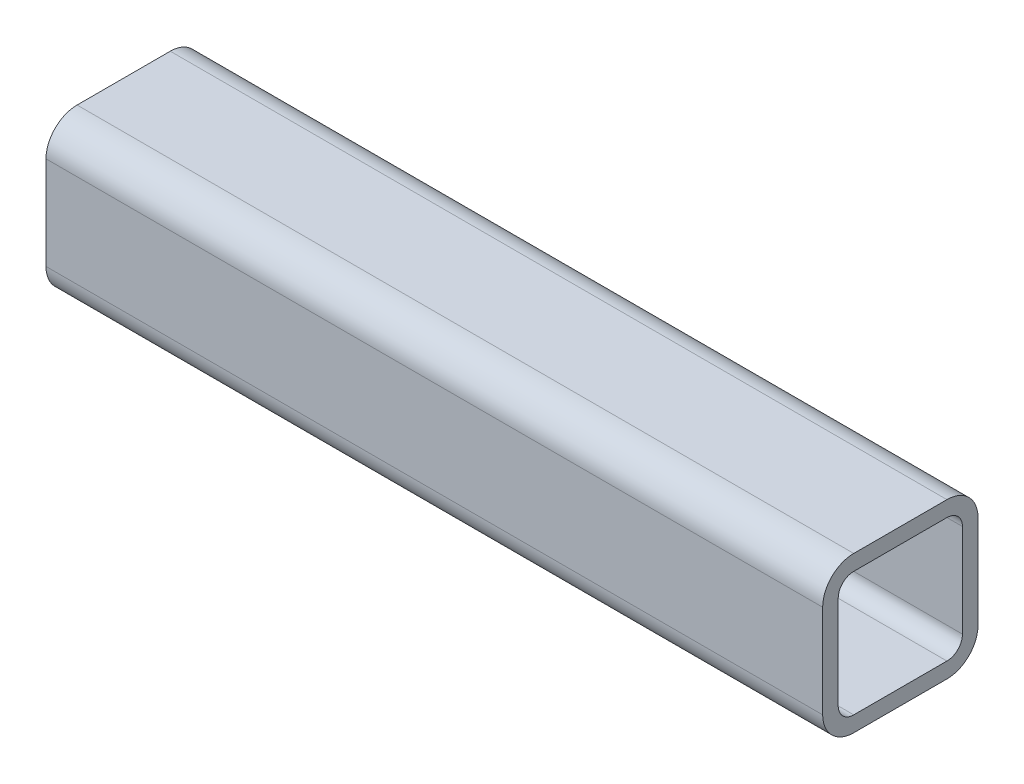
ISO-10303-21;
HEADER;
FILE_DESCRIPTION(('STEP AP214'),'2;1');
FILE_NAME('part.step','',(''),(''),'','','');
FILE_SCHEMA(('AUTOMOTIVE_DESIGN { 1 0 10303 214 1 1 1 1 }'));
ENDSEC;
DATA;
#1=APPLICATION_CONTEXT('core data for automotive mechanical design processes');
#2=APPLICATION_PROTOCOL_DEFINITION('international standard','automotive_design',2000,#1);
#3=PRODUCT_CONTEXT('',#1,'mechanical');
#4=PRODUCT('Part','Part','',(#3));
#5=PRODUCT_RELATED_PRODUCT_CATEGORY('part','',(#4));
#6=PRODUCT_DEFINITION_FORMATION('','',#4);
#7=PRODUCT_DEFINITION_CONTEXT('part definition',#1,'design');
#8=PRODUCT_DEFINITION('design','',#6,#7);
#9=PRODUCT_DEFINITION_SHAPE('','',#8);
#10=(LENGTH_UNIT() NAMED_UNIT(*) SI_UNIT(.MILLI.,.METRE.));
#11=(NAMED_UNIT(*) PLANE_ANGLE_UNIT() SI_UNIT($,.RADIAN.));
#12=(NAMED_UNIT(*) SI_UNIT($,.STERADIAN.) SOLID_ANGLE_UNIT());
#13=UNCERTAINTY_MEASURE_WITH_UNIT(LENGTH_MEASURE(1.E-05),#10,'distance_accuracy_value','');
#14=(GEOMETRIC_REPRESENTATION_CONTEXT(3) GLOBAL_UNCERTAINTY_ASSIGNED_CONTEXT((#13)) GLOBAL_UNIT_ASSIGNED_CONTEXT((#10,
#11,#12)) REPRESENTATION_CONTEXT('',''));
#15=CARTESIAN_POINT('',(0.,0.,0.));
#16=DIRECTION('',(0.,0.,1.));
#17=DIRECTION('',(1.,0.,0.));
#18=AXIS2_PLACEMENT_3D('',#15,#16,#17);
#19=CARTESIAN_POINT('',(50.,-79.9999999999999,-1094.));
#20=DIRECTION('',(1.,0.,0.));
#21=DIRECTION('',(0.,0.,-1.));
#22=AXIS2_PLACEMENT_3D('',#19,#20,#21);
#23=PLANE('',#22);
#24=DIRECTION('',(0.,1.,0.));
#25=VECTOR('',#24,1.);
#26=CARTESIAN_POINT('',(50.,-85.9999999999999,-1095.));
#27=LINE('',#26,#25);
#28=CARTESIAN_POINT('',(50.,-85.9999999999998,-1095.));
#29=VERTEX_POINT('',#28);
#30=CARTESIAN_POINT('',(50.,-73.9999999999998,-1095.));
#31=VERTEX_POINT('',#30);
#32=EDGE_CURVE('E11',#29,#31,#27,.T.);
#33=ORIENTED_EDGE('',*,*,#32,.T.);
#34=CARTESIAN_POINT('',(50.,-73.9999999999999,-1091.));
#35=DIRECTION('',(1.,0.,0.));
#36=DIRECTION('',(0.,0.,-1.));
#37=AXIS2_PLACEMENT_3D('',#34,#35,#36);
#38=CIRCLE('',#37,4.);
#39=CARTESIAN_POINT('',(50.,-69.9999999999999,-1091.));
#40=VERTEX_POINT('',#39);
#41=EDGE_CURVE('E249',#31,#40,#38,.T.);
#42=ORIENTED_EDGE('',*,*,#41,.T.);
#43=DIRECTION('',(0.,0.,1.));
#44=VECTOR('',#43,1.);
#45=CARTESIAN_POINT('',(50.,-69.9999999999999,-1079.));
#46=LINE('',#45,#44);
#47=CARTESIAN_POINT('',(50.,-69.9999999999999,-1079.));
#48=VERTEX_POINT('',#47);
#49=EDGE_CURVE('E246',#40,#48,#46,.T.);
#50=ORIENTED_EDGE('',*,*,#49,.T.);
#51=CARTESIAN_POINT('',(50.,-73.9999999999999,-1079.));
#52=DIRECTION('',(1.,0.,0.));
#53=DIRECTION('',(0.,0.,-1.));
#54=AXIS2_PLACEMENT_3D('',#51,#52,#53);
#55=CIRCLE('',#54,4.);
#56=CARTESIAN_POINT('',(50.,-73.9999999999999,-1075.));
#57=VERTEX_POINT('',#56);
#58=EDGE_CURVE('E243',#48,#57,#55,.T.);
#59=ORIENTED_EDGE('',*,*,#58,.T.);
#60=DIRECTION('',(0.,-1.,0.));
#61=VECTOR('',#60,1.);
#62=CARTESIAN_POINT('',(50.,-73.9999999999999,-1075.));
#63=LINE('',#62,#61);
#64=CARTESIAN_POINT('',(50.,-85.9999999999999,-1075.));
#65=VERTEX_POINT('',#64);
#66=EDGE_CURVE('E240',#57,#65,#63,.T.);
#67=ORIENTED_EDGE('',*,*,#66,.T.);
#68=CARTESIAN_POINT('',(50.,-85.9999999999999,-1079.));
#69=DIRECTION('',(1.,0.,0.));
#70=DIRECTION('',(0.,0.,-1.));
#71=AXIS2_PLACEMENT_3D('',#68,#69,#70);
#72=CIRCLE('',#71,4.);
#73=CARTESIAN_POINT('',(50.,-89.9999999999999,-1079.));
#74=VERTEX_POINT('',#73);
#75=EDGE_CURVE('E237',#65,#74,#72,.T.);
#76=ORIENTED_EDGE('',*,*,#75,.T.);
#77=DIRECTION('',(0.,0.,-1.));
#78=VECTOR('',#77,1.);
#79=CARTESIAN_POINT('',(50.,-89.9999999999999,-1091.));
#80=LINE('',#79,#78);
#81=CARTESIAN_POINT('',(50.,-89.9999999999999,-1091.));
#82=VERTEX_POINT('',#81);
#83=EDGE_CURVE('E234',#74,#82,#80,.T.);
#84=ORIENTED_EDGE('',*,*,#83,.T.);
#85=CARTESIAN_POINT('',(50.,-85.9999999999999,-1091.));
#86=DIRECTION('',(1.,0.,0.));
#87=DIRECTION('',(0.,0.,-1.));
#88=AXIS2_PLACEMENT_3D('',#85,#86,#87);
#89=CIRCLE('',#88,4.);
#90=EDGE_CURVE('E185',#82,#29,#89,.T.);
#91=ORIENTED_EDGE('',*,*,#90,.T.);
#92=EDGE_LOOP('',(#33,#42,#50,#59,#67,#76,#84,#91));
#93=FACE_BOUND('',#92,.T.);
#94=CARTESIAN_POINT('',(50.,-73.9999999999999,-1091.));
#95=DIRECTION('',(1.,0.,0.));
#96=DIRECTION('',(0.,0.,-1.));
#97=AXIS2_PLACEMENT_3D('',#94,#95,#96);
#98=CIRCLE('',#97,2.);
#99=CARTESIAN_POINT('',(50.,-73.9999999999999,-1093.));
#100=VERTEX_POINT('',#99);
#101=CARTESIAN_POINT('',(50.,-71.9999999999999,-1091.));
#102=VERTEX_POINT('',#101);
#103=EDGE_CURVE('E217',#100,#102,#98,.T.);
#104=ORIENTED_EDGE('',*,*,#103,.F.);
#105=DIRECTION('',(0.,1.,0.));
#106=VECTOR('',#105,1.);
#107=CARTESIAN_POINT('',(50.,-85.9999999999999,-1093.));
#108=LINE('',#107,#106);
#109=CARTESIAN_POINT('',(50.,-85.9999999999998,-1093.));
#110=VERTEX_POINT('',#109);
#111=EDGE_CURVE('E173',#110,#100,#108,.T.);
#112=ORIENTED_EDGE('',*,*,#111,.F.);
#113=CARTESIAN_POINT('',(50.,-85.9999999999999,-1091.));
#114=DIRECTION('',(1.,0.,0.));
#115=DIRECTION('',(0.,0.,-1.));
#116=AXIS2_PLACEMENT_3D('',#113,#114,#115);
#117=CIRCLE('',#116,2.);
#118=CARTESIAN_POINT('',(50.,-87.9999999999999,-1091.));
#119=VERTEX_POINT('',#118);
#120=EDGE_CURVE('E70',#119,#110,#117,.T.);
#121=ORIENTED_EDGE('',*,*,#120,.F.);
#122=DIRECTION('',(0.,0.,-1.));
#123=VECTOR('',#122,1.);
#124=CARTESIAN_POINT('',(50.,-87.9999999999999,-1091.));
#125=LINE('',#124,#123);
#126=CARTESIAN_POINT('',(50.,-87.9999999999999,-1079.));
#127=VERTEX_POINT('',#126);
#128=EDGE_CURVE('E82',#127,#119,#125,.T.);
#129=ORIENTED_EDGE('',*,*,#128,.F.);
#130=CARTESIAN_POINT('',(50.,-85.9999999999999,-1079.));
#131=DIRECTION('',(1.,0.,0.));
#132=DIRECTION('',(0.,0.,-1.));
#133=AXIS2_PLACEMENT_3D('',#130,#131,#132);
#134=CIRCLE('',#133,2.);
#135=CARTESIAN_POINT('',(50.,-85.9999999999999,-1077.));
#136=VERTEX_POINT('',#135);
#137=EDGE_CURVE('E222',#136,#127,#134,.T.);
#138=ORIENTED_EDGE('',*,*,#137,.F.);
#139=DIRECTION('',(0.,-1.,0.));
#140=VECTOR('',#139,1.);
#141=CARTESIAN_POINT('',(50.,-73.9999999999999,-1077.));
#142=LINE('',#141,#140);
#143=CARTESIAN_POINT('',(50.,-73.9999999999999,-1077.));
#144=VERTEX_POINT('',#143);
#145=EDGE_CURVE('E212',#144,#136,#142,.T.);
#146=ORIENTED_EDGE('',*,*,#145,.F.);
#147=CARTESIAN_POINT('',(50.,-73.9999999999999,-1079.));
#148=DIRECTION('',(1.,0.,0.));
#149=DIRECTION('',(0.,0.,-1.));
#150=AXIS2_PLACEMENT_3D('',#147,#148,#149);
#151=CIRCLE('',#150,2.);
#152=CARTESIAN_POINT('',(50.,-71.9999999999999,-1079.));
#153=VERTEX_POINT('',#152);
#154=EDGE_CURVE('E209',#153,#144,#151,.T.);
#155=ORIENTED_EDGE('',*,*,#154,.F.);
#156=DIRECTION('',(0.,0.,1.));
#157=VECTOR('',#156,1.);
#158=CARTESIAN_POINT('',(50.,-71.9999999999999,-1079.));
#159=LINE('',#158,#157);
#160=EDGE_CURVE('E204',#102,#153,#159,.T.);
#161=ORIENTED_EDGE('',*,*,#160,.F.);
#162=EDGE_LOOP('',(#104,#112,#121,#129,#138,#146,#155,#161));
#163=FACE_BOUND('',#162,.T.);
#164=ADVANCED_FACE('F41',(#93,#163),#23,.T.);
#165=CARTESIAN_POINT('',(-50.0000000000002,-73.9999999999998,-1085.));
#166=DIRECTION('',(-1.,0.,0.));
#167=DIRECTION('',(0.,0.,1.));
#168=AXIS2_PLACEMENT_3D('',#165,#166,#167);
#169=PLANE('',#168);
#170=CARTESIAN_POINT('',(-50.0000000000002,-73.9999999999999,-1091.));
#171=DIRECTION('',(-1.,0.,0.));
#172=DIRECTION('',(0.,0.,1.));
#173=AXIS2_PLACEMENT_3D('',#170,#171,#172);
#174=CIRCLE('',#173,4.);
#175=CARTESIAN_POINT('',(-50.0000000000002,-69.9999999999999,-1091.));
#176=VERTEX_POINT('',#175);
#177=CARTESIAN_POINT('',(-50.0000000000002,-73.9999999999998,-1095.));
#178=VERTEX_POINT('',#177);
#179=EDGE_CURVE('E190',#176,#178,#174,.T.);
#180=ORIENTED_EDGE('',*,*,#179,.T.);
#181=DIRECTION('',(0.,-1.,0.));
#182=VECTOR('',#181,1.);
#183=CARTESIAN_POINT('',(-50.0000000000002,-85.9999999999999,-1095.));
#184=LINE('',#183,#182);
#185=CARTESIAN_POINT('',(-50.0000000000002,-85.9999999999998,-1095.));
#186=VERTEX_POINT('',#185);
#187=EDGE_CURVE('E182',#178,#186,#184,.T.);
#188=ORIENTED_EDGE('',*,*,#187,.T.);
#189=CARTESIAN_POINT('',(-50.0000000000002,-85.9999999999999,-1091.));
#190=DIRECTION('',(-1.,0.,0.));
#191=DIRECTION('',(0.,0.,1.));
#192=AXIS2_PLACEMENT_3D('',#189,#190,#191);
#193=CIRCLE('',#192,4.);
#194=CARTESIAN_POINT('',(-50.0000000000002,-89.9999999999999,-1091.));
#195=VERTEX_POINT('',#194);
#196=EDGE_CURVE('E192',#186,#195,#193,.T.);
#197=ORIENTED_EDGE('',*,*,#196,.T.);
#198=DIRECTION('',(0.,0.,1.));
#199=VECTOR('',#198,1.);
#200=CARTESIAN_POINT('',(-50.0000000000002,-89.9999999999999,-1091.));
#201=LINE('',#200,#199);
#202=CARTESIAN_POINT('',(-50.0000000000002,-89.9999999999999,-1079.));
#203=VERTEX_POINT('',#202);
#204=EDGE_CURVE('E194',#195,#203,#201,.T.);
#205=ORIENTED_EDGE('',*,*,#204,.T.);
#206=CARTESIAN_POINT('',(-50.0000000000002,-85.9999999999999,-1079.));
#207=DIRECTION('',(-1.,0.,0.));
#208=DIRECTION('',(0.,0.,1.));
#209=AXIS2_PLACEMENT_3D('',#206,#207,#208);
#210=CIRCLE('',#209,4.);
#211=CARTESIAN_POINT('',(-50.0000000000002,-85.9999999999999,-1075.));
#212=VERTEX_POINT('',#211);
#213=EDGE_CURVE('E196',#203,#212,#210,.T.);
#214=ORIENTED_EDGE('',*,*,#213,.T.);
#215=DIRECTION('',(0.,1.,0.));
#216=VECTOR('',#215,1.);
#217=CARTESIAN_POINT('',(-50.0000000000002,-73.9999999999999,-1075.));
#218=LINE('',#217,#216);
#219=CARTESIAN_POINT('',(-50.0000000000002,-73.9999999999999,-1075.));
#220=VERTEX_POINT('',#219);
#221=EDGE_CURVE('E184',#212,#220,#218,.T.);
#222=ORIENTED_EDGE('',*,*,#221,.T.);
#223=CARTESIAN_POINT('',(-50.0000000000002,-73.9999999999999,-1079.));
#224=DIRECTION('',(-1.,0.,0.));
#225=DIRECTION('',(0.,0.,1.));
#226=AXIS2_PLACEMENT_3D('',#223,#224,#225);
#227=CIRCLE('',#226,4.);
#228=CARTESIAN_POINT('',(-50.0000000000002,-69.9999999999999,-1079.));
#229=VERTEX_POINT('',#228);
#230=EDGE_CURVE('E186',#220,#229,#227,.T.);
#231=ORIENTED_EDGE('',*,*,#230,.T.);
#232=DIRECTION('',(0.,0.,-1.));
#233=VECTOR('',#232,1.);
#234=CARTESIAN_POINT('',(-50.0000000000002,-69.9999999999999,-1079.));
#235=LINE('',#234,#233);
#236=EDGE_CURVE('E188',#229,#176,#235,.T.);
#237=ORIENTED_EDGE('',*,*,#236,.T.);
#238=EDGE_LOOP('',(#180,#188,#197,#205,#214,#222,#231,#237));
#239=FACE_BOUND('',#238,.T.);
#240=DIRECTION('',(0.,-1.,0.));
#241=VECTOR('',#240,1.);
#242=CARTESIAN_POINT('',(-50.0000000000002,-85.9999999999999,-1093.));
#243=LINE('',#242,#241);
#244=CARTESIAN_POINT('',(-50.0000000000002,-73.9999999999998,-1093.));
#245=VERTEX_POINT('',#244);
#246=CARTESIAN_POINT('',(-50.0000000000002,-85.9999999999999,-1093.));
#247=VERTEX_POINT('',#246);
#248=EDGE_CURVE('E163',#245,#247,#243,.T.);
#249=ORIENTED_EDGE('',*,*,#248,.F.);
#250=CARTESIAN_POINT('',(-50.0000000000002,-73.9999999999999,-1091.));
#251=DIRECTION('',(-1.,0.,0.));
#252=DIRECTION('',(0.,0.,1.));
#253=AXIS2_PLACEMENT_3D('',#250,#251,#252);
#254=CIRCLE('',#253,2.);
#255=CARTESIAN_POINT('',(-50.0000000000002,-71.9999999999999,-1091.));
#256=VERTEX_POINT('',#255);
#257=EDGE_CURVE('E213',#256,#245,#254,.T.);
#258=ORIENTED_EDGE('',*,*,#257,.F.);
#259=DIRECTION('',(0.,0.,-1.));
#260=VECTOR('',#259,1.);
#261=CARTESIAN_POINT('',(-50.0000000000002,-71.9999999999999,-1079.));
#262=LINE('',#261,#260);
#263=CARTESIAN_POINT('',(-50.0000000000002,-71.9999999999999,-1079.));
#264=VERTEX_POINT('',#263);
#265=EDGE_CURVE('E200',#264,#256,#262,.T.);
#266=ORIENTED_EDGE('',*,*,#265,.F.);
#267=CARTESIAN_POINT('',(-50.0000000000002,-73.9999999999999,-1079.));
#268=DIRECTION('',(-1.,0.,0.));
#269=DIRECTION('',(0.,0.,1.));
#270=AXIS2_PLACEMENT_3D('',#267,#268,#269);
#271=CIRCLE('',#270,2.);
#272=CARTESIAN_POINT('',(-50.0000000000002,-73.9999999999999,-1077.));
#273=VERTEX_POINT('',#272);
#274=EDGE_CURVE('E205',#273,#264,#271,.T.);
#275=ORIENTED_EDGE('',*,*,#274,.F.);
#276=DIRECTION('',(0.,1.,0.));
#277=VECTOR('',#276,1.);
#278=CARTESIAN_POINT('',(-50.0000000000002,-73.9999999999999,-1077.));
#279=LINE('',#278,#277);
#280=CARTESIAN_POINT('',(-50.0000000000002,-85.9999999999999,-1077.));
#281=VERTEX_POINT('',#280);
#282=EDGE_CURVE('E174',#281,#273,#279,.T.);
#283=ORIENTED_EDGE('',*,*,#282,.F.);
#284=CARTESIAN_POINT('',(-50.0000000000002,-85.9999999999999,-1079.));
#285=DIRECTION('',(-1.,0.,0.));
#286=DIRECTION('',(0.,0.,1.));
#287=AXIS2_PLACEMENT_3D('',#284,#285,#286);
#288=CIRCLE('',#287,2.);
#289=CARTESIAN_POINT('',(-50.0000000000002,-87.9999999999999,-1079.));
#290=VERTEX_POINT('',#289);
#291=EDGE_CURVE('E218',#290,#281,#288,.T.);
#292=ORIENTED_EDGE('',*,*,#291,.F.);
#293=DIRECTION('',(0.,0.,1.));
#294=VECTOR('',#293,1.);
#295=CARTESIAN_POINT('',(-50.0000000000002,-87.9999999999999,-1091.));
#296=LINE('',#295,#294);
#297=CARTESIAN_POINT('',(-50.0000000000002,-87.9999999999999,-1091.));
#298=VERTEX_POINT('',#297);
#299=EDGE_CURVE('E166',#298,#290,#296,.T.);
#300=ORIENTED_EDGE('',*,*,#299,.F.);
#301=CARTESIAN_POINT('',(-50.0000000000002,-85.9999999999999,-1091.));
#302=DIRECTION('',(-1.,0.,0.));
#303=DIRECTION('',(0.,0.,1.));
#304=AXIS2_PLACEMENT_3D('',#301,#302,#303);
#305=CIRCLE('',#304,2.);
#306=EDGE_CURVE('E160',#247,#298,#305,.T.);
#307=ORIENTED_EDGE('',*,*,#306,.F.);
#308=EDGE_LOOP('',(#249,#258,#266,#275,#283,#292,#300,#307));
#309=FACE_BOUND('',#308,.T.);
#310=ADVANCED_FACE('F161',(#239,#309),#169,.T.);
#311=CARTESIAN_POINT('',(-59.9999999999999,-85.9999999999999,-1079.));
#312=DIRECTION('',(1.,0.,0.));
#313=DIRECTION('',(0.,0.,-1.));
#314=AXIS2_PLACEMENT_3D('',#311,#312,#313);
#315=CYLINDRICAL_SURFACE('',#314,2.);
#316=DIRECTION('',(1.,0.,0.));
#317=VECTOR('',#316,1.);
#318=CARTESIAN_POINT('',(-59.9999999999999,-85.9999999999999,-1077.));
#319=LINE('',#318,#317);
#320=EDGE_CURVE('E198',#281,#136,#319,.T.);
#321=ORIENTED_EDGE('',*,*,#320,.T.);
#322=ORIENTED_EDGE('',*,*,#137,.T.);
#323=DIRECTION('',(1.,0.,0.));
#324=VECTOR('',#323,1.);
#325=CARTESIAN_POINT('',(-59.9999999999999,-87.9999999999999,-1079.));
#326=LINE('',#325,#324);
#327=EDGE_CURVE('E221',#290,#127,#326,.T.);
#328=ORIENTED_EDGE('',*,*,#327,.F.);
#329=ORIENTED_EDGE('',*,*,#291,.T.);
#330=EDGE_LOOP('',(#321,#322,#328,#329));
#331=FACE_BOUND('',#330,.T.);
#332=ADVANCED_FACE('F299',(#331),#315,.F.);
#333=CARTESIAN_POINT('',(-59.9999999999999,-87.9999999999999,-1091.));
#334=DIRECTION('',(0.,1.,0.));
#335=DIRECTION('',(0.,0.,1.));
#336=AXIS2_PLACEMENT_3D('',#333,#334,#335);
#337=PLANE('',#336);
#338=ORIENTED_EDGE('',*,*,#327,.T.);
#339=ORIENTED_EDGE('',*,*,#128,.T.);
#340=DIRECTION('',(1.,0.,0.));
#341=VECTOR('',#340,1.);
#342=CARTESIAN_POINT('',(-59.9999999999999,-87.9999999999999,-1091.));
#343=LINE('',#342,#341);
#344=EDGE_CURVE('E223',#298,#119,#343,.T.);
#345=ORIENTED_EDGE('',*,*,#344,.F.);
#346=ORIENTED_EDGE('',*,*,#299,.T.);
#347=EDGE_LOOP('',(#338,#339,#345,#346));
#348=FACE_BOUND('',#347,.T.);
#349=ADVANCED_FACE('F300',(#348),#337,.T.);
#350=CARTESIAN_POINT('',(-59.9999999999999,-85.9999999999999,-1091.));
#351=DIRECTION('',(1.,0.,0.));
#352=DIRECTION('',(0.,0.,-1.));
#353=AXIS2_PLACEMENT_3D('',#350,#351,#352);
#354=CYLINDRICAL_SURFACE('',#353,2.);
#355=ORIENTED_EDGE('',*,*,#344,.T.);
#356=ORIENTED_EDGE('',*,*,#120,.T.);
#357=DIRECTION('',(1.,0.,0.));
#358=VECTOR('',#357,1.);
#359=CARTESIAN_POINT('',(-59.9999999999999,-85.9999999999999,-1093.));
#360=LINE('',#359,#358);
#361=EDGE_CURVE('E169',#247,#110,#360,.T.);
#362=ORIENTED_EDGE('',*,*,#361,.F.);
#363=ORIENTED_EDGE('',*,*,#306,.T.);
#364=EDGE_LOOP('',(#355,#356,#362,#363));
#365=FACE_BOUND('',#364,.T.);
#366=ADVANCED_FACE('F170',(#365),#354,.F.);
#367=CARTESIAN_POINT('',(-59.9999999999999,-73.9999999999999,-1091.));
#368=DIRECTION('',(1.,0.,0.));
#369=DIRECTION('',(0.,0.,-1.));
#370=AXIS2_PLACEMENT_3D('',#367,#368,#369);
#371=CYLINDRICAL_SURFACE('',#370,2.);
#372=DIRECTION('',(1.,0.,0.));
#373=VECTOR('',#372,1.);
#374=CARTESIAN_POINT('',(-59.9999999999999,-73.9999999999999,-1093.));
#375=LINE('',#374,#373);
#376=EDGE_CURVE('E44',#245,#100,#375,.T.);
#377=ORIENTED_EDGE('',*,*,#376,.T.);
#378=ORIENTED_EDGE('',*,*,#103,.T.);
#379=DIRECTION('',(1.,0.,0.));
#380=VECTOR('',#379,1.);
#381=CARTESIAN_POINT('',(-59.9999999999999,-71.9999999999999,-1091.));
#382=LINE('',#381,#380);
#383=EDGE_CURVE('E216',#256,#102,#382,.T.);
#384=ORIENTED_EDGE('',*,*,#383,.F.);
#385=ORIENTED_EDGE('',*,*,#257,.T.);
#386=EDGE_LOOP('',(#377,#378,#384,#385));
#387=FACE_BOUND('',#386,.T.);
#388=ADVANCED_FACE('F286',(#387),#371,.F.);
#389=CARTESIAN_POINT('',(-59.9999999999999,-71.9999999999999,-1079.));
#390=DIRECTION('',(0.,-1.,0.));
#391=DIRECTION('',(0.,0.,-1.));
#392=AXIS2_PLACEMENT_3D('',#389,#390,#391);
#393=PLANE('',#392);
#394=ORIENTED_EDGE('',*,*,#383,.T.);
#395=ORIENTED_EDGE('',*,*,#160,.T.);
#396=DIRECTION('',(1.,0.,0.));
#397=VECTOR('',#396,1.);
#398=CARTESIAN_POINT('',(-59.9999999999999,-71.9999999999999,-1079.));
#399=LINE('',#398,#397);
#400=EDGE_CURVE('E203',#264,#153,#399,.T.);
#401=ORIENTED_EDGE('',*,*,#400,.F.);
#402=ORIENTED_EDGE('',*,*,#265,.T.);
#403=EDGE_LOOP('',(#394,#395,#401,#402));
#404=FACE_BOUND('',#403,.T.);
#405=ADVANCED_FACE('F288',(#404),#393,.T.);
#406=CARTESIAN_POINT('',(-59.9999999999999,-73.9999999999999,-1079.));
#407=DIRECTION('',(1.,0.,0.));
#408=DIRECTION('',(0.,0.,-1.));
#409=AXIS2_PLACEMENT_3D('',#406,#407,#408);
#410=CYLINDRICAL_SURFACE('',#409,2.);
#411=ORIENTED_EDGE('',*,*,#400,.T.);
#412=ORIENTED_EDGE('',*,*,#154,.T.);
#413=DIRECTION('',(1.,0.,0.));
#414=VECTOR('',#413,1.);
#415=CARTESIAN_POINT('',(-59.9999999999999,-73.9999999999999,-1077.));
#416=LINE('',#415,#414);
#417=EDGE_CURVE('E208',#273,#144,#416,.T.);
#418=ORIENTED_EDGE('',*,*,#417,.F.);
#419=ORIENTED_EDGE('',*,*,#274,.T.);
#420=EDGE_LOOP('',(#411,#412,#418,#419));
#421=FACE_BOUND('',#420,.T.);
#422=ADVANCED_FACE('F293',(#421),#410,.F.);
#423=CARTESIAN_POINT('',(-59.9999999999999,-73.9999999999999,-1077.));
#424=DIRECTION('',(0.,0.,-1.));
#425=DIRECTION('',(-1.,0.,0.));
#426=AXIS2_PLACEMENT_3D('',#423,#424,#425);
#427=PLANE('',#426);
#428=ORIENTED_EDGE('',*,*,#417,.T.);
#429=ORIENTED_EDGE('',*,*,#145,.T.);
#430=ORIENTED_EDGE('',*,*,#320,.F.);
#431=ORIENTED_EDGE('',*,*,#282,.T.);
#432=EDGE_LOOP('',(#428,#429,#430,#431));
#433=FACE_BOUND('',#432,.T.);
#434=ADVANCED_FACE('F296',(#433),#427,.T.);
#435=CARTESIAN_POINT('',(-59.9999999999999,-85.9999999999999,-1093.));
#436=DIRECTION('',(0.,0.,1.));
#437=DIRECTION('',(1.,0.,0.));
#438=AXIS2_PLACEMENT_3D('',#435,#436,#437);
#439=PLANE('',#438);
#440=ORIENTED_EDGE('',*,*,#361,.T.);
#441=ORIENTED_EDGE('',*,*,#111,.T.);
#442=ORIENTED_EDGE('',*,*,#376,.F.);
#443=ORIENTED_EDGE('',*,*,#248,.T.);
#444=EDGE_LOOP('',(#440,#441,#442,#443));
#445=FACE_BOUND('',#444,.T.);
#446=ADVANCED_FACE('F175',(#445),#439,.T.);
#447=CARTESIAN_POINT('',(-59.9999999999999,-85.9999999999999,-1091.));
#448=DIRECTION('',(1.,0.,0.));
#449=DIRECTION('',(0.,0.,-1.));
#450=AXIS2_PLACEMENT_3D('',#447,#448,#449);
#451=CYLINDRICAL_SURFACE('',#450,4.);
#452=ORIENTED_EDGE('',*,*,#90,.F.);
#453=DIRECTION('',(1.,0.,0.));
#454=VECTOR('',#453,1.);
#455=CARTESIAN_POINT('',(-59.9999999999999,-89.9999999999999,-1091.));
#456=LINE('',#455,#454);
#457=EDGE_CURVE('E178',#195,#82,#456,.T.);
#458=ORIENTED_EDGE('',*,*,#457,.F.);
#459=ORIENTED_EDGE('',*,*,#196,.F.);
#460=DIRECTION('',(1.,0.,0.));
#461=VECTOR('',#460,1.);
#462=CARTESIAN_POINT('',(-59.9999999999999,-85.9999999999999,-1095.));
#463=LINE('',#462,#461);
#464=EDGE_CURVE('E176',#186,#29,#463,.T.);
#465=ORIENTED_EDGE('',*,*,#464,.T.);
#466=EDGE_LOOP('',(#452,#458,#459,#465));
#467=FACE_BOUND('',#466,.T.);
#468=ADVANCED_FACE('F345',(#467),#451,.T.);
#469=CARTESIAN_POINT('',(-59.9999999999999,-89.9999999999999,-1091.));
#470=DIRECTION('',(0.,1.,0.));
#471=DIRECTION('',(0.,0.,1.));
#472=AXIS2_PLACEMENT_3D('',#469,#470,#471);
#473=PLANE('',#472);
#474=ORIENTED_EDGE('',*,*,#83,.F.);
#475=DIRECTION('',(1.,0.,0.));
#476=VECTOR('',#475,1.);
#477=CARTESIAN_POINT('',(-59.9999999999999,-89.9999999999999,-1079.));
#478=LINE('',#477,#476);
#479=EDGE_CURVE('E262',#203,#74,#478,.T.);
#480=ORIENTED_EDGE('',*,*,#479,.F.);
#481=ORIENTED_EDGE('',*,*,#204,.F.);
#482=ORIENTED_EDGE('',*,*,#457,.T.);
#483=EDGE_LOOP('',(#474,#480,#481,#482));
#484=FACE_BOUND('',#483,.T.);
#485=ADVANCED_FACE('F340',(#484),#473,.F.);
#486=CARTESIAN_POINT('',(-59.9999999999999,-85.9999999999999,-1079.));
#487=DIRECTION('',(1.,0.,0.));
#488=DIRECTION('',(0.,0.,-1.));
#489=AXIS2_PLACEMENT_3D('',#486,#487,#488);
#490=CYLINDRICAL_SURFACE('',#489,4.);
#491=ORIENTED_EDGE('',*,*,#75,.F.);
#492=DIRECTION('',(1.,0.,0.));
#493=VECTOR('',#492,1.);
#494=CARTESIAN_POINT('',(-59.9999999999999,-85.9999999999999,-1075.));
#495=LINE('',#494,#493);
#496=EDGE_CURVE('E256',#212,#65,#495,.T.);
#497=ORIENTED_EDGE('',*,*,#496,.F.);
#498=ORIENTED_EDGE('',*,*,#213,.F.);
#499=ORIENTED_EDGE('',*,*,#479,.T.);
#500=EDGE_LOOP('',(#491,#497,#498,#499));
#501=FACE_BOUND('',#500,.T.);
#502=ADVANCED_FACE('F337',(#501),#490,.T.);
#503=CARTESIAN_POINT('',(-59.9999999999999,-73.9999999999999,-1079.));
#504=DIRECTION('',(1.,0.,0.));
#505=DIRECTION('',(0.,0.,-1.));
#506=AXIS2_PLACEMENT_3D('',#503,#504,#505);
#507=CYLINDRICAL_SURFACE('',#506,4.);
#508=ORIENTED_EDGE('',*,*,#58,.F.);
#509=DIRECTION('',(1.,0.,0.));
#510=VECTOR('',#509,1.);
#511=CARTESIAN_POINT('',(-59.9999999999999,-69.9999999999999,-1079.));
#512=LINE('',#511,#510);
#513=EDGE_CURVE('E252',#229,#48,#512,.T.);
#514=ORIENTED_EDGE('',*,*,#513,.F.);
#515=ORIENTED_EDGE('',*,*,#230,.F.);
#516=DIRECTION('',(1.,0.,0.));
#517=VECTOR('',#516,1.);
#518=CARTESIAN_POINT('',(-59.9999999999999,-73.9999999999999,-1075.));
#519=LINE('',#518,#517);
#520=EDGE_CURVE('E265',#220,#57,#519,.T.);
#521=ORIENTED_EDGE('',*,*,#520,.T.);
#522=EDGE_LOOP('',(#508,#514,#515,#521));
#523=FACE_BOUND('',#522,.T.);
#524=ADVANCED_FACE('F328',(#523),#507,.T.);
#525=CARTESIAN_POINT('',(-59.9999999999999,-73.9999999999999,-1075.));
#526=DIRECTION('',(0.,0.,-1.));
#527=DIRECTION('',(-1.,0.,0.));
#528=AXIS2_PLACEMENT_3D('',#525,#526,#527);
#529=PLANE('',#528);
#530=ORIENTED_EDGE('',*,*,#66,.F.);
#531=ORIENTED_EDGE('',*,*,#520,.F.);
#532=ORIENTED_EDGE('',*,*,#221,.F.);
#533=ORIENTED_EDGE('',*,*,#496,.T.);
#534=EDGE_LOOP('',(#530,#531,#532,#533));
#535=FACE_BOUND('',#534,.T.);
#536=ADVANCED_FACE('F333',(#535),#529,.F.);
#537=CARTESIAN_POINT('',(-59.9999999999999,-69.9999999999999,-1079.));
#538=DIRECTION('',(0.,-1.,0.));
#539=DIRECTION('',(0.,0.,-1.));
#540=AXIS2_PLACEMENT_3D('',#537,#538,#539);
#541=PLANE('',#540);
#542=ORIENTED_EDGE('',*,*,#49,.F.);
#543=DIRECTION('',(1.,0.,0.));
#544=VECTOR('',#543,1.);
#545=CARTESIAN_POINT('',(-59.9999999999999,-69.9999999999999,-1091.));
#546=LINE('',#545,#544);
#547=EDGE_CURVE('E255',#176,#40,#546,.T.);
#548=ORIENTED_EDGE('',*,*,#547,.F.);
#549=ORIENTED_EDGE('',*,*,#236,.F.);
#550=ORIENTED_EDGE('',*,*,#513,.T.);
#551=EDGE_LOOP('',(#542,#548,#549,#550));
#552=FACE_BOUND('',#551,.T.);
#553=ADVANCED_FACE('F325',(#552),#541,.F.);
#554=CARTESIAN_POINT('',(-59.9999999999999,-73.9999999999999,-1091.));
#555=DIRECTION('',(1.,0.,0.));
#556=DIRECTION('',(0.,0.,-1.));
#557=AXIS2_PLACEMENT_3D('',#554,#555,#556);
#558=CYLINDRICAL_SURFACE('',#557,4.);
#559=ORIENTED_EDGE('',*,*,#41,.F.);
#560=DIRECTION('',(1.,0.,0.));
#561=VECTOR('',#560,1.);
#562=CARTESIAN_POINT('',(-59.9999999999999,-73.9999999999999,-1095.));
#563=LINE('',#562,#561);
#564=EDGE_CURVE('E50',#178,#31,#563,.T.);
#565=ORIENTED_EDGE('',*,*,#564,.F.);
#566=ORIENTED_EDGE('',*,*,#179,.F.);
#567=ORIENTED_EDGE('',*,*,#547,.T.);
#568=EDGE_LOOP('',(#559,#565,#566,#567));
#569=FACE_BOUND('',#568,.T.);
#570=ADVANCED_FACE('F319',(#569),#558,.T.);
#571=CARTESIAN_POINT('',(-59.9999999999999,-85.9999999999999,-1095.));
#572=DIRECTION('',(0.,0.,1.));
#573=DIRECTION('',(1.,0.,0.));
#574=AXIS2_PLACEMENT_3D('',#571,#572,#573);
#575=PLANE('',#574);
#576=ORIENTED_EDGE('',*,*,#32,.F.);
#577=ORIENTED_EDGE('',*,*,#464,.F.);
#578=ORIENTED_EDGE('',*,*,#187,.F.);
#579=ORIENTED_EDGE('',*,*,#564,.T.);
#580=EDGE_LOOP('',(#576,#577,#578,#579));
#581=FACE_BOUND('',#580,.T.);
#582=ADVANCED_FACE('F346',(#581),#575,.F.);
#583=CLOSED_SHELL('',(#164,#310,#332,#349,#366,#388,#405,#422,#434,#446,#468,#485,#502,#524,
#536,#553,#570,#582));
#584=MANIFOLD_SOLID_BREP('B2',#583);
#585=ADVANCED_BREP_SHAPE_REPRESENTATION('',(#18,#584),#14);
#586=SHAPE_DEFINITION_REPRESENTATION(#9,#585);
ENDSEC;
END-ISO-10303-21;
